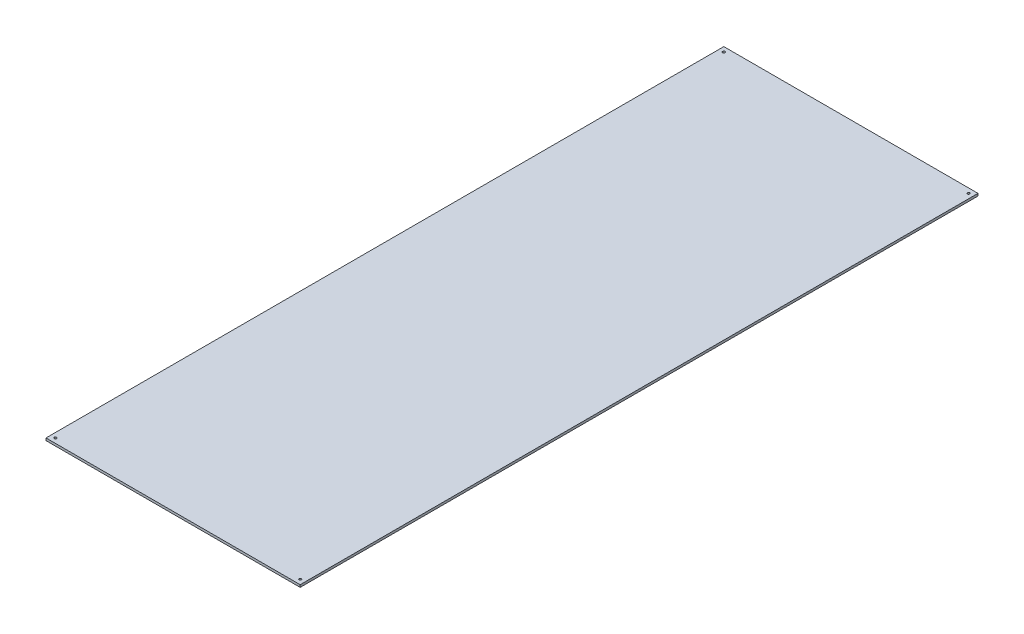
ISO-10303-21;
HEADER;
FILE_DESCRIPTION(('STEP AP214'),'2;1');
FILE_NAME('part.step','',(''),(''),'','','');
FILE_SCHEMA(('AUTOMOTIVE_DESIGN { 1 0 10303 214 1 1 1 1 }'));
ENDSEC;
DATA;
#1=APPLICATION_CONTEXT('core data for automotive mechanical design processes');
#2=APPLICATION_PROTOCOL_DEFINITION('international standard','automotive_design',2000,#1);
#3=PRODUCT_CONTEXT('',#1,'mechanical');
#4=PRODUCT('Part','Part','',(#3));
#5=PRODUCT_RELATED_PRODUCT_CATEGORY('part','',(#4));
#6=PRODUCT_DEFINITION_FORMATION('','',#4);
#7=PRODUCT_DEFINITION_CONTEXT('part definition',#1,'design');
#8=PRODUCT_DEFINITION('design','',#6,#7);
#9=PRODUCT_DEFINITION_SHAPE('','',#8);
#10=(LENGTH_UNIT() NAMED_UNIT(*) SI_UNIT(.MILLI.,.METRE.));
#11=(NAMED_UNIT(*) PLANE_ANGLE_UNIT() SI_UNIT($,.RADIAN.));
#12=(NAMED_UNIT(*) SI_UNIT($,.STERADIAN.) SOLID_ANGLE_UNIT());
#13=UNCERTAINTY_MEASURE_WITH_UNIT(LENGTH_MEASURE(1.E-05),#10,'distance_accuracy_value','');
#14=(GEOMETRIC_REPRESENTATION_CONTEXT(3) GLOBAL_UNCERTAINTY_ASSIGNED_CONTEXT((#13)) GLOBAL_UNIT_ASSIGNED_CONTEXT((#10,
#11,#12)) REPRESENTATION_CONTEXT('',''));
#15=CARTESIAN_POINT('',(0.,0.,0.));
#16=DIRECTION('',(0.,0.,1.));
#17=DIRECTION('',(1.,0.,0.));
#18=AXIS2_PLACEMENT_3D('',#15,#16,#17);
#19=CARTESIAN_POINT('',(342.9,6.35,914.4));
#20=DIRECTION('',(-1.,0.,0.));
#21=DIRECTION('',(0.,0.,1.));
#22=AXIS2_PLACEMENT_3D('',#19,#20,#21);
#23=PLANE('',#22);
#24=DIRECTION('',(0.,0.,-1.));
#25=VECTOR('',#24,1.);
#26=CARTESIAN_POINT('',(342.9,0.,914.4));
#27=LINE('',#26,#25);
#28=CARTESIAN_POINT('',(342.9,0.,914.4));
#29=VERTEX_POINT('',#28);
#30=CARTESIAN_POINT('',(342.9,0.,-914.4));
#31=VERTEX_POINT('',#30);
#32=EDGE_CURVE('E110',#29,#31,#27,.T.);
#33=ORIENTED_EDGE('',*,*,#32,.T.);
#34=DIRECTION('',(0.,-1.,0.));
#35=VECTOR('',#34,1.);
#36=CARTESIAN_POINT('',(342.9,6.35,-914.4));
#37=LINE('',#36,#35);
#38=CARTESIAN_POINT('',(342.9,6.35,-914.4));
#39=VERTEX_POINT('',#38);
#40=EDGE_CURVE('E11',#39,#31,#37,.T.);
#41=ORIENTED_EDGE('',*,*,#40,.F.);
#42=DIRECTION('',(0.,0.,-1.));
#43=VECTOR('',#42,1.);
#44=CARTESIAN_POINT('',(342.9,6.35,914.4));
#45=LINE('',#44,#43);
#46=CARTESIAN_POINT('',(342.9,6.35,914.4));
#47=VERTEX_POINT('',#46);
#48=EDGE_CURVE('E94',#47,#39,#45,.T.);
#49=ORIENTED_EDGE('',*,*,#48,.F.);
#50=DIRECTION('',(0.,-1.,0.));
#51=VECTOR('',#50,1.);
#52=CARTESIAN_POINT('',(342.9,6.35,914.4));
#53=LINE('',#52,#51);
#54=EDGE_CURVE('E106',#47,#29,#53,.T.);
#55=ORIENTED_EDGE('',*,*,#54,.T.);
#56=EDGE_LOOP('',(#33,#41,#49,#55));
#57=FACE_BOUND('',#56,.T.);
#58=ADVANCED_FACE('F42',(#57),#23,.F.);
#59=CARTESIAN_POINT('',(-342.9,6.35,-914.4));
#60=DIRECTION('',(0.,0.,1.));
#61=DIRECTION('',(1.,0.,0.));
#62=AXIS2_PLACEMENT_3D('',#59,#60,#61);
#63=PLANE('',#62);
#64=DIRECTION('',(-1.,0.,0.));
#65=VECTOR('',#64,1.);
#66=CARTESIAN_POINT('',(-342.9,0.,-914.4));
#67=LINE('',#66,#65);
#68=CARTESIAN_POINT('',(-342.9,0.,-914.4));
#69=VERTEX_POINT('',#68);
#70=EDGE_CURVE('E99',#31,#69,#67,.T.);
#71=ORIENTED_EDGE('',*,*,#70,.T.);
#72=DIRECTION('',(0.,-1.,0.));
#73=VECTOR('',#72,1.);
#74=CARTESIAN_POINT('',(-342.9,6.35,-914.4));
#75=LINE('',#74,#73);
#76=CARTESIAN_POINT('',(-342.9,6.35,-914.4));
#77=VERTEX_POINT('',#76);
#78=EDGE_CURVE('E51',#77,#69,#75,.T.);
#79=ORIENTED_EDGE('',*,*,#78,.F.);
#80=DIRECTION('',(-1.,0.,0.));
#81=VECTOR('',#80,1.);
#82=CARTESIAN_POINT('',(-342.9,6.35,-914.4));
#83=LINE('',#82,#81);
#84=EDGE_CURVE('E89',#39,#77,#83,.T.);
#85=ORIENTED_EDGE('',*,*,#84,.F.);
#86=ORIENTED_EDGE('',*,*,#40,.T.);
#87=EDGE_LOOP('',(#71,#79,#85,#86));
#88=FACE_BOUND('',#87,.T.);
#89=ADVANCED_FACE('F98',(#88),#63,.F.);
#90=CARTESIAN_POINT('',(-342.9,6.35,914.4));
#91=DIRECTION('',(1.,0.,0.));
#92=DIRECTION('',(0.,0.,-1.));
#93=AXIS2_PLACEMENT_3D('',#90,#91,#92);
#94=PLANE('',#93);
#95=DIRECTION('',(0.,0.,1.));
#96=VECTOR('',#95,1.);
#97=CARTESIAN_POINT('',(-342.9,0.,914.4));
#98=LINE('',#97,#96);
#99=CARTESIAN_POINT('',(-342.9,0.,914.4));
#100=VERTEX_POINT('',#99);
#101=EDGE_CURVE('E76',#69,#100,#98,.T.);
#102=ORIENTED_EDGE('',*,*,#101,.T.);
#103=DIRECTION('',(0.,-1.,0.));
#104=VECTOR('',#103,1.);
#105=CARTESIAN_POINT('',(-342.9,6.35,914.4));
#106=LINE('',#105,#104);
#107=CARTESIAN_POINT('',(-342.9,6.35,914.4));
#108=VERTEX_POINT('',#107);
#109=EDGE_CURVE('E101',#108,#100,#106,.T.);
#110=ORIENTED_EDGE('',*,*,#109,.F.);
#111=DIRECTION('',(0.,0.,1.));
#112=VECTOR('',#111,1.);
#113=CARTESIAN_POINT('',(-342.9,6.35,914.4));
#114=LINE('',#113,#112);
#115=EDGE_CURVE('E92',#77,#108,#114,.T.);
#116=ORIENTED_EDGE('',*,*,#115,.F.);
#117=ORIENTED_EDGE('',*,*,#78,.T.);
#118=EDGE_LOOP('',(#102,#110,#116,#117));
#119=FACE_BOUND('',#118,.T.);
#120=ADVANCED_FACE('F102',(#119),#94,.F.);
#121=CARTESIAN_POINT('',(-342.9,6.35,914.4));
#122=DIRECTION('',(0.,0.,-1.));
#123=DIRECTION('',(-1.,0.,0.));
#124=AXIS2_PLACEMENT_3D('',#121,#122,#123);
#125=PLANE('',#124);
#126=DIRECTION('',(1.,0.,0.));
#127=VECTOR('',#126,1.);
#128=CARTESIAN_POINT('',(-342.9,0.,914.4));
#129=LINE('',#128,#127);
#130=EDGE_CURVE('E82',#100,#29,#129,.T.);
#131=ORIENTED_EDGE('',*,*,#130,.T.);
#132=ORIENTED_EDGE('',*,*,#54,.F.);
#133=DIRECTION('',(1.,0.,0.));
#134=VECTOR('',#133,1.);
#135=CARTESIAN_POINT('',(-342.9,6.35,914.4));
#136=LINE('',#135,#134);
#137=EDGE_CURVE('E59',#108,#47,#136,.T.);
#138=ORIENTED_EDGE('',*,*,#137,.F.);
#139=ORIENTED_EDGE('',*,*,#109,.T.);
#140=EDGE_LOOP('',(#131,#132,#138,#139));
#141=FACE_BOUND('',#140,.T.);
#142=ADVANCED_FACE('F124',(#141),#125,.F.);
#143=CARTESIAN_POINT('',(0.,6.35,0.));
#144=DIRECTION('',(0.,-1.,0.));
#145=DIRECTION('',(0.,0.,-1.));
#146=AXIS2_PLACEMENT_3D('',#143,#144,#145);
#147=PLANE('',#146);
#148=CARTESIAN_POINT('',(-330.2,6.35,901.7));
#149=DIRECTION('',(0.,1.,0.));
#150=DIRECTION('',(0.,0.,1.));
#151=AXIS2_PLACEMENT_3D('',#148,#149,#150);
#152=CIRCLE('',#151,3.17499999999997);
#153=CARTESIAN_POINT('',(-330.2,6.35,904.875));
#154=VERTEX_POINT('',#153);
#155=EDGE_CURVE('E135',#154,#154,#152,.T.);
#156=ORIENTED_EDGE('',*,*,#155,.F.);
#157=EDGE_LOOP('',(#156));
#158=FACE_BOUND('',#157,.T.);
#159=CARTESIAN_POINT('',(330.2,6.35,-901.7));
#160=DIRECTION('',(0.,1.,0.));
#161=DIRECTION('',(0.,0.,1.));
#162=AXIS2_PLACEMENT_3D('',#159,#160,#161);
#163=CIRCLE('',#162,3.17499999999997);
#164=CARTESIAN_POINT('',(330.2,6.35,-898.525));
#165=VERTEX_POINT('',#164);
#166=EDGE_CURVE('E143',#165,#165,#163,.T.);
#167=ORIENTED_EDGE('',*,*,#166,.F.);
#168=EDGE_LOOP('',(#167));
#169=FACE_BOUND('',#168,.T.);
#170=CARTESIAN_POINT('',(-330.2,6.35,-901.7));
#171=DIRECTION('',(0.,1.,0.));
#172=DIRECTION('',(0.,0.,1.));
#173=AXIS2_PLACEMENT_3D('',#170,#171,#172);
#174=CIRCLE('',#173,3.17499999999997);
#175=CARTESIAN_POINT('',(-330.2,6.35,-898.525));
#176=VERTEX_POINT('',#175);
#177=EDGE_CURVE('E144',#176,#176,#174,.T.);
#178=ORIENTED_EDGE('',*,*,#177,.F.);
#179=EDGE_LOOP('',(#178));
#180=FACE_BOUND('',#179,.T.);
#181=CARTESIAN_POINT('',(330.2,6.35,901.7));
#182=DIRECTION('',(0.,1.,0.));
#183=DIRECTION('',(0.,0.,1.));
#184=AXIS2_PLACEMENT_3D('',#181,#182,#183);
#185=CIRCLE('',#184,3.17499999999997);
#186=CARTESIAN_POINT('',(330.2,6.35,904.875));
#187=VERTEX_POINT('',#186);
#188=EDGE_CURVE('E131',#187,#187,#185,.T.);
#189=ORIENTED_EDGE('',*,*,#188,.F.);
#190=EDGE_LOOP('',(#189));
#191=FACE_BOUND('',#190,.T.);
#192=ORIENTED_EDGE('',*,*,#48,.T.);
#193=ORIENTED_EDGE('',*,*,#84,.T.);
#194=ORIENTED_EDGE('',*,*,#115,.T.);
#195=ORIENTED_EDGE('',*,*,#137,.T.);
#196=EDGE_LOOP('',(#192,#193,#194,#195));
#197=FACE_BOUND('',#196,.T.);
#198=ADVANCED_FACE('F90',(#158,#169,#180,#191,#197),#147,.F.);
#199=CARTESIAN_POINT('',(0.,0.,0.));
#200=DIRECTION('',(0.,-1.,0.));
#201=DIRECTION('',(0.,0.,-1.));
#202=AXIS2_PLACEMENT_3D('',#199,#200,#201);
#203=PLANE('',#202);
#204=CARTESIAN_POINT('',(-330.2,0.,901.7));
#205=DIRECTION('',(0.,1.,0.));
#206=DIRECTION('',(0.,0.,1.));
#207=AXIS2_PLACEMENT_3D('',#204,#205,#206);
#208=CIRCLE('',#207,3.17499999999997);
#209=CARTESIAN_POINT('',(-330.2,0.,904.875));
#210=VERTEX_POINT('',#209);
#211=EDGE_CURVE('E148',#210,#210,#208,.T.);
#212=ORIENTED_EDGE('',*,*,#211,.T.);
#213=EDGE_LOOP('',(#212));
#214=FACE_BOUND('',#213,.T.);
#215=CARTESIAN_POINT('',(330.2,0.,-901.7));
#216=DIRECTION('',(0.,1.,0.));
#217=DIRECTION('',(0.,0.,1.));
#218=AXIS2_PLACEMENT_3D('',#215,#216,#217);
#219=CIRCLE('',#218,3.17499999999997);
#220=CARTESIAN_POINT('',(330.2,0.,-898.525));
#221=VERTEX_POINT('',#220);
#222=EDGE_CURVE('E139',#221,#221,#219,.T.);
#223=ORIENTED_EDGE('',*,*,#222,.T.);
#224=EDGE_LOOP('',(#223));
#225=FACE_BOUND('',#224,.T.);
#226=CARTESIAN_POINT('',(-330.2,0.,-901.7));
#227=DIRECTION('',(0.,1.,0.));
#228=DIRECTION('',(0.,0.,1.));
#229=AXIS2_PLACEMENT_3D('',#226,#227,#228);
#230=CIRCLE('',#229,3.17499999999997);
#231=CARTESIAN_POINT('',(-330.2,0.,-898.525));
#232=VERTEX_POINT('',#231);
#233=EDGE_CURVE('E155',#232,#232,#230,.T.);
#234=ORIENTED_EDGE('',*,*,#233,.T.);
#235=EDGE_LOOP('',(#234));
#236=FACE_BOUND('',#235,.T.);
#237=CARTESIAN_POINT('',(330.2,0.,901.7));
#238=DIRECTION('',(0.,1.,0.));
#239=DIRECTION('',(0.,0.,1.));
#240=AXIS2_PLACEMENT_3D('',#237,#238,#239);
#241=CIRCLE('',#240,3.17499999999997);
#242=CARTESIAN_POINT('',(330.2,0.,904.875));
#243=VERTEX_POINT('',#242);
#244=EDGE_CURVE('E114',#243,#243,#241,.T.);
#245=ORIENTED_EDGE('',*,*,#244,.T.);
#246=EDGE_LOOP('',(#245));
#247=FACE_BOUND('',#246,.T.);
#248=ORIENTED_EDGE('',*,*,#32,.F.);
#249=ORIENTED_EDGE('',*,*,#130,.F.);
#250=ORIENTED_EDGE('',*,*,#101,.F.);
#251=ORIENTED_EDGE('',*,*,#70,.F.);
#252=EDGE_LOOP('',(#248,#249,#250,#251));
#253=FACE_BOUND('',#252,.T.);
#254=ADVANCED_FACE('F127',(#214,#225,#236,#247,#253),#203,.T.);
#255=CARTESIAN_POINT('',(330.2,0.,901.7));
#256=DIRECTION('',(0.,1.,0.));
#257=DIRECTION('',(0.,0.,1.));
#258=AXIS2_PLACEMENT_3D('',#255,#256,#257);
#259=CYLINDRICAL_SURFACE('',#258,3.17499999999997);
#260=ORIENTED_EDGE('',*,*,#244,.F.);
#261=EDGE_LOOP('',(#260));
#262=FACE_BOUND('',#261,.T.);
#263=ORIENTED_EDGE('',*,*,#188,.T.);
#264=EDGE_LOOP('',(#263));
#265=FACE_BOUND('',#264,.T.);
#266=ADVANCED_FACE('F171',(#262,#265),#259,.F.);
#267=CARTESIAN_POINT('',(-330.2,0.,-901.7));
#268=DIRECTION('',(0.,1.,0.));
#269=DIRECTION('',(0.,0.,1.));
#270=AXIS2_PLACEMENT_3D('',#267,#268,#269);
#271=CYLINDRICAL_SURFACE('',#270,3.17499999999997);
#272=ORIENTED_EDGE('',*,*,#233,.F.);
#273=EDGE_LOOP('',(#272));
#274=FACE_BOUND('',#273,.T.);
#275=ORIENTED_EDGE('',*,*,#177,.T.);
#276=EDGE_LOOP('',(#275));
#277=FACE_BOUND('',#276,.T.);
#278=ADVANCED_FACE('F163',(#274,#277),#271,.F.);
#279=CARTESIAN_POINT('',(330.2,0.,-901.7));
#280=DIRECTION('',(0.,1.,0.));
#281=DIRECTION('',(0.,0.,1.));
#282=AXIS2_PLACEMENT_3D('',#279,#280,#281);
#283=CYLINDRICAL_SURFACE('',#282,3.17499999999997);
#284=ORIENTED_EDGE('',*,*,#222,.F.);
#285=EDGE_LOOP('',(#284));
#286=FACE_BOUND('',#285,.T.);
#287=ORIENTED_EDGE('',*,*,#166,.T.);
#288=EDGE_LOOP('',(#287));
#289=FACE_BOUND('',#288,.T.);
#290=ADVANCED_FACE('F179',(#286,#289),#283,.F.);
#291=CARTESIAN_POINT('',(-330.2,0.,901.7));
#292=DIRECTION('',(0.,1.,0.));
#293=DIRECTION('',(0.,0.,1.));
#294=AXIS2_PLACEMENT_3D('',#291,#292,#293);
#295=CYLINDRICAL_SURFACE('',#294,3.17499999999997);
#296=ORIENTED_EDGE('',*,*,#211,.F.);
#297=EDGE_LOOP('',(#296));
#298=FACE_BOUND('',#297,.T.);
#299=ORIENTED_EDGE('',*,*,#155,.T.);
#300=EDGE_LOOP('',(#299));
#301=FACE_BOUND('',#300,.T.);
#302=ADVANCED_FACE('F233',(#298,#301),#295,.F.);
#303=CLOSED_SHELL('',(#58,#89,#120,#142,#198,#254,#266,#278,#290,#302));
#304=MANIFOLD_SOLID_BREP('B2',#303);
#305=ADVANCED_BREP_SHAPE_REPRESENTATION('',(#18,#304),#14);
#306=SHAPE_DEFINITION_REPRESENTATION(#9,#305);
ENDSEC;
END-ISO-10303-21;
